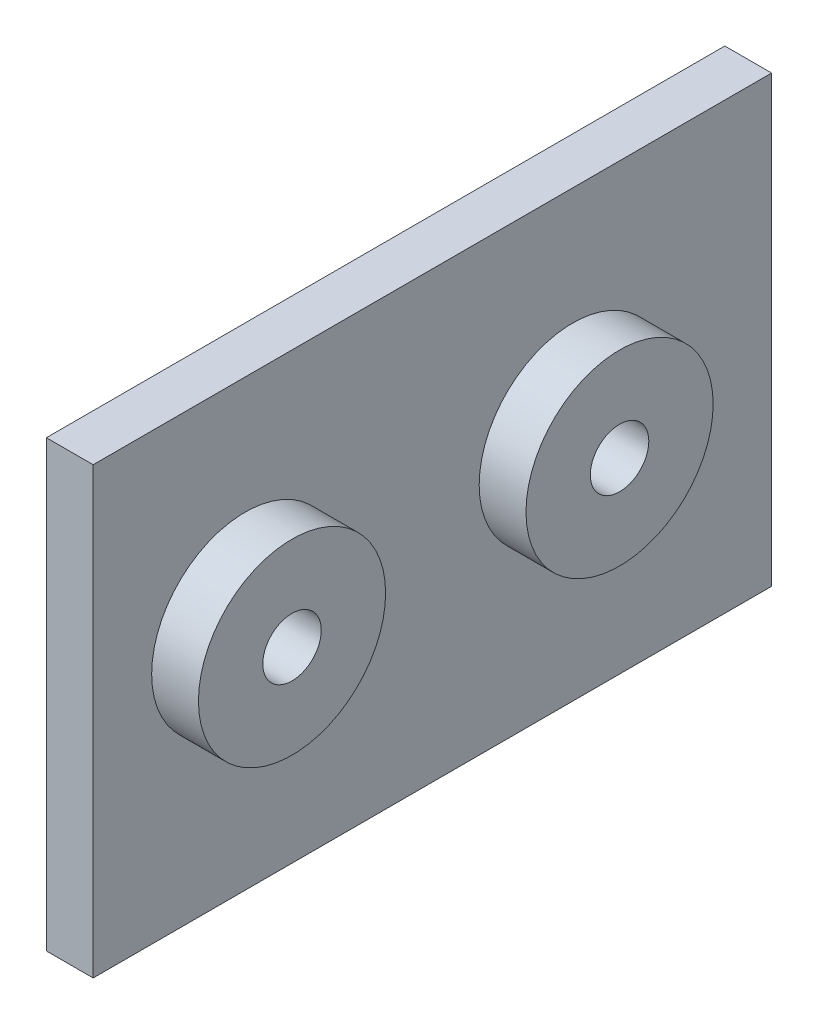
ISO-10303-21;
HEADER;
FILE_DESCRIPTION(('STEP AP214'),'2;1');
FILE_NAME('part.step','',(''),(''),'','','');
FILE_SCHEMA(('AUTOMOTIVE_DESIGN { 1 0 10303 214 1 1 1 1 }'));
ENDSEC;
DATA;
#1=APPLICATION_CONTEXT('core data for automotive mechanical design processes');
#2=APPLICATION_PROTOCOL_DEFINITION('international standard','automotive_design',2000,#1);
#3=PRODUCT_CONTEXT('',#1,'mechanical');
#4=PRODUCT('Part','Part','',(#3));
#5=PRODUCT_RELATED_PRODUCT_CATEGORY('part','',(#4));
#6=PRODUCT_DEFINITION_FORMATION('','',#4);
#7=PRODUCT_DEFINITION_CONTEXT('part definition',#1,'design');
#8=PRODUCT_DEFINITION('design','',#6,#7);
#9=PRODUCT_DEFINITION_SHAPE('','',#8);
#10=(LENGTH_UNIT() NAMED_UNIT(*) SI_UNIT(.MILLI.,.METRE.));
#11=(NAMED_UNIT(*) PLANE_ANGLE_UNIT() SI_UNIT($,.RADIAN.));
#12=(NAMED_UNIT(*) SI_UNIT($,.STERADIAN.) SOLID_ANGLE_UNIT());
#13=UNCERTAINTY_MEASURE_WITH_UNIT(LENGTH_MEASURE(1.E-05),#10,'distance_accuracy_value','');
#14=(GEOMETRIC_REPRESENTATION_CONTEXT(3) GLOBAL_UNCERTAINTY_ASSIGNED_CONTEXT((#13)) GLOBAL_UNIT_ASSIGNED_CONTEXT((#10,
#11,#12)) REPRESENTATION_CONTEXT('',''));
#15=CARTESIAN_POINT('',(0.,0.,0.));
#16=DIRECTION('',(0.,0.,1.));
#17=DIRECTION('',(1.,0.,0.));
#18=AXIS2_PLACEMENT_3D('',#15,#16,#17);
#19=CARTESIAN_POINT('',(2.,0.,0.));
#20=DIRECTION('',(1.,0.,0.));
#21=DIRECTION('',(0.,0.,-1.));
#22=AXIS2_PLACEMENT_3D('',#19,#20,#21);
#23=PLANE('',#22);
#24=CARTESIAN_POINT('',(2.,0.,5.92692307692308));
#25=DIRECTION('',(1.,0.,0.));
#26=DIRECTION('',(0.,0.,-1.));
#27=AXIS2_PLACEMENT_3D('',#24,#25,#26);
#28=CIRCLE('',#27,4.);
#29=CARTESIAN_POINT('',(2.,0.,1.92692307692308));
#30=VERTEX_POINT('',#29);
#31=EDGE_CURVE('E204',#30,#30,#28,.T.);
#32=ORIENTED_EDGE('',*,*,#31,.F.);
#33=EDGE_LOOP('',(#32));
#34=FACE_BOUND('',#33,.T.);
#35=CARTESIAN_POINT('',(2.,0.,-8.07307692307692));
#36=DIRECTION('',(1.,0.,0.));
#37=DIRECTION('',(0.,0.,-1.));
#38=AXIS2_PLACEMENT_3D('',#35,#36,#37);
#39=CIRCLE('',#38,4.);
#40=CARTESIAN_POINT('',(2.,0.,-12.0730769230769));
#41=VERTEX_POINT('',#40);
#42=EDGE_CURVE('E11',#41,#41,#39,.T.);
#43=ORIENTED_EDGE('',*,*,#42,.F.);
#44=EDGE_LOOP('',(#43));
#45=FACE_BOUND('',#44,.T.);
#46=DIRECTION('',(0.,-1.,0.));
#47=VECTOR('',#46,1.);
#48=CARTESIAN_POINT('',(2.,9.00192307692308,12.4269230769231));
#49=LINE('',#48,#47);
#50=CARTESIAN_POINT('',(2.,9.00192307692308,12.4269230769231));
#51=VERTEX_POINT('',#50);
#52=CARTESIAN_POINT('',(2.,-9.99807692307692,12.4269230769231));
#53=VERTEX_POINT('',#52);
#54=EDGE_CURVE('E152',#51,#53,#49,.T.);
#55=ORIENTED_EDGE('',*,*,#54,.T.);
#56=DIRECTION('',(0.,0.,-1.));
#57=VECTOR('',#56,1.);
#58=CARTESIAN_POINT('',(2.,-9.99807692307692,12.4269230769231));
#59=LINE('',#58,#57);
#60=CARTESIAN_POINT('',(2.,-9.99807692307692,-16.5730769230769));
#61=VERTEX_POINT('',#60);
#62=EDGE_CURVE('E155',#53,#61,#59,.T.);
#63=ORIENTED_EDGE('',*,*,#62,.T.);
#64=DIRECTION('',(0.,1.,0.));
#65=VECTOR('',#64,1.);
#66=CARTESIAN_POINT('',(2.,9.00192307692308,-16.5730769230769));
#67=LINE('',#66,#65);
#68=CARTESIAN_POINT('',(2.,9.00192307692308,-16.5730769230769));
#69=VERTEX_POINT('',#68);
#70=EDGE_CURVE('E158',#61,#69,#67,.T.);
#71=ORIENTED_EDGE('',*,*,#70,.T.);
#72=DIRECTION('',(0.,0.,1.));
#73=VECTOR('',#72,1.);
#74=CARTESIAN_POINT('',(2.,9.00192307692308,12.4269230769231));
#75=LINE('',#74,#73);
#76=EDGE_CURVE('E160',#69,#51,#75,.T.);
#77=ORIENTED_EDGE('',*,*,#76,.T.);
#78=EDGE_LOOP('',(#55,#63,#71,#77));
#79=FACE_BOUND('',#78,.T.);
#80=ADVANCED_FACE('F35',(#34,#45,#79),#23,.T.);
#81=CARTESIAN_POINT('',(0.,0.,0.));
#82=DIRECTION('',(1.,0.,0.));
#83=DIRECTION('',(0.,0.,-1.));
#84=AXIS2_PLACEMENT_3D('',#81,#82,#83);
#85=PLANE('',#84);
#86=DIRECTION('',(0.,-1.,0.));
#87=VECTOR('',#86,1.);
#88=CARTESIAN_POINT('',(0.,9.00192307692308,12.4269230769231));
#89=LINE('',#88,#87);
#90=CARTESIAN_POINT('',(0.,9.00192307692308,12.4269230769231));
#91=VERTEX_POINT('',#90);
#92=CARTESIAN_POINT('',(0.,-9.99807692307692,12.4269230769231));
#93=VERTEX_POINT('',#92);
#94=EDGE_CURVE('E141',#91,#93,#89,.T.);
#95=ORIENTED_EDGE('',*,*,#94,.F.);
#96=DIRECTION('',(0.,0.,1.));
#97=VECTOR('',#96,1.);
#98=CARTESIAN_POINT('',(0.,9.00192307692308,12.4269230769231));
#99=LINE('',#98,#97);
#100=CARTESIAN_POINT('',(0.,9.00192307692308,-16.5730769230769));
#101=VERTEX_POINT('',#100);
#102=EDGE_CURVE('E156',#101,#91,#99,.T.);
#103=ORIENTED_EDGE('',*,*,#102,.F.);
#104=DIRECTION('',(0.,1.,0.));
#105=VECTOR('',#104,1.);
#106=CARTESIAN_POINT('',(0.,9.00192307692308,-16.5730769230769));
#107=LINE('',#106,#105);
#108=CARTESIAN_POINT('',(0.,-9.99807692307692,-16.5730769230769));
#109=VERTEX_POINT('',#108);
#110=EDGE_CURVE('E164',#109,#101,#107,.T.);
#111=ORIENTED_EDGE('',*,*,#110,.F.);
#112=DIRECTION('',(0.,0.,-1.));
#113=VECTOR('',#112,1.);
#114=CARTESIAN_POINT('',(0.,-9.99807692307692,12.4269230769231));
#115=LINE('',#114,#113);
#116=EDGE_CURVE('E143',#93,#109,#115,.T.);
#117=ORIENTED_EDGE('',*,*,#116,.F.);
#118=EDGE_LOOP('',(#95,#103,#111,#117));
#119=FACE_BOUND('',#118,.T.);
#120=CARTESIAN_POINT('',(0.,0.00192307692307883,-8.07307692307692));
#121=DIRECTION('',(1.,0.,0.));
#122=DIRECTION('',(0.,0.,-1.));
#123=AXIS2_PLACEMENT_3D('',#120,#121,#122);
#124=CIRCLE('',#123,1.25);
#125=CARTESIAN_POINT('',(0.,0.00192307692307883,-9.32307692307692));
#126=VERTEX_POINT('',#125);
#127=EDGE_CURVE('E96',#126,#126,#124,.T.);
#128=ORIENTED_EDGE('',*,*,#127,.T.);
#129=EDGE_LOOP('',(#128));
#130=FACE_BOUND('',#129,.T.);
#131=CARTESIAN_POINT('',(0.,0.0019230769230772,5.92692307692308));
#132=DIRECTION('',(1.,0.,0.));
#133=DIRECTION('',(0.,0.,-1.));
#134=AXIS2_PLACEMENT_3D('',#131,#132,#133);
#135=CIRCLE('',#134,1.25);
#136=CARTESIAN_POINT('',(0.,0.0019230769230772,4.67692307692308));
#137=VERTEX_POINT('',#136);
#138=EDGE_CURVE('E97',#137,#137,#135,.T.);
#139=ORIENTED_EDGE('',*,*,#138,.T.);
#140=EDGE_LOOP('',(#139));
#141=FACE_BOUND('',#140,.T.);
#142=ADVANCED_FACE('F187',(#119,#130,#141),#85,.F.);
#143=CARTESIAN_POINT('',(2.,9.00192307692308,12.4269230769231));
#144=DIRECTION('',(0.,0.,-1.));
#145=DIRECTION('',(0.,1.,0.));
#146=AXIS2_PLACEMENT_3D('',#143,#144,#145);
#147=PLANE('',#146);
#148=ORIENTED_EDGE('',*,*,#94,.T.);
#149=DIRECTION('',(-1.,0.,0.));
#150=VECTOR('',#149,1.);
#151=CARTESIAN_POINT('',(2.,-9.99807692307692,12.4269230769231));
#152=LINE('',#151,#150);
#153=EDGE_CURVE('E175',#53,#93,#152,.T.);
#154=ORIENTED_EDGE('',*,*,#153,.F.);
#155=ORIENTED_EDGE('',*,*,#54,.F.);
#156=DIRECTION('',(-1.,0.,0.));
#157=VECTOR('',#156,1.);
#158=CARTESIAN_POINT('',(2.,9.00192307692308,12.4269230769231));
#159=LINE('',#158,#157);
#160=EDGE_CURVE('E161',#51,#91,#159,.T.);
#161=ORIENTED_EDGE('',*,*,#160,.T.);
#162=EDGE_LOOP('',(#148,#154,#155,#161));
#163=FACE_BOUND('',#162,.T.);
#164=ADVANCED_FACE('F37',(#163),#147,.F.);
#165=CARTESIAN_POINT('',(2.,-9.99807692307692,12.4269230769231));
#166=DIRECTION('',(0.,1.,0.));
#167=DIRECTION('',(0.,0.,1.));
#168=AXIS2_PLACEMENT_3D('',#165,#166,#167);
#169=PLANE('',#168);
#170=ORIENTED_EDGE('',*,*,#116,.T.);
#171=DIRECTION('',(-1.,0.,0.));
#172=VECTOR('',#171,1.);
#173=CARTESIAN_POINT('',(2.,-9.99807692307692,-16.5730769230769));
#174=LINE('',#173,#172);
#175=EDGE_CURVE('E172',#61,#109,#174,.T.);
#176=ORIENTED_EDGE('',*,*,#175,.F.);
#177=ORIENTED_EDGE('',*,*,#62,.F.);
#178=ORIENTED_EDGE('',*,*,#153,.T.);
#179=EDGE_LOOP('',(#170,#176,#177,#178));
#180=FACE_BOUND('',#179,.T.);
#181=ADVANCED_FACE('F179',(#180),#169,.F.);
#182=CARTESIAN_POINT('',(2.,9.00192307692308,-16.5730769230769));
#183=DIRECTION('',(0.,0.,1.));
#184=DIRECTION('',(1.,0.,0.));
#185=AXIS2_PLACEMENT_3D('',#182,#183,#184);
#186=PLANE('',#185);
#187=ORIENTED_EDGE('',*,*,#110,.T.);
#188=DIRECTION('',(-1.,0.,0.));
#189=VECTOR('',#188,1.);
#190=CARTESIAN_POINT('',(2.,9.00192307692308,-16.5730769230769));
#191=LINE('',#190,#189);
#192=EDGE_CURVE('E169',#69,#101,#191,.T.);
#193=ORIENTED_EDGE('',*,*,#192,.F.);
#194=ORIENTED_EDGE('',*,*,#70,.F.);
#195=ORIENTED_EDGE('',*,*,#175,.T.);
#196=EDGE_LOOP('',(#187,#193,#194,#195));
#197=FACE_BOUND('',#196,.T.);
#198=ADVANCED_FACE('F191',(#197),#186,.F.);
#199=CARTESIAN_POINT('',(2.,9.00192307692308,12.4269230769231));
#200=DIRECTION('',(0.,-1.,0.));
#201=DIRECTION('',(0.,0.,-1.));
#202=AXIS2_PLACEMENT_3D('',#199,#200,#201);
#203=PLANE('',#202);
#204=ORIENTED_EDGE('',*,*,#102,.T.);
#205=ORIENTED_EDGE('',*,*,#160,.F.);
#206=ORIENTED_EDGE('',*,*,#76,.F.);
#207=ORIENTED_EDGE('',*,*,#192,.T.);
#208=EDGE_LOOP('',(#204,#205,#206,#207));
#209=FACE_BOUND('',#208,.T.);
#210=ADVANCED_FACE('F124',(#209),#203,.F.);
#211=CARTESIAN_POINT('',(2.,0.00192307692307883,-8.07307692307692));
#212=DIRECTION('',(-1.,0.,0.));
#213=DIRECTION('',(0.,0.,1.));
#214=AXIS2_PLACEMENT_3D('',#211,#212,#213);
#215=CYLINDRICAL_SURFACE('',#214,1.25);
#216=CARTESIAN_POINT('',(2.,0.00192307692307883,-8.07307692307692));
#217=DIRECTION('',(1.,0.,0.));
#218=DIRECTION('',(0.,-0.000769230769231596,0.999999704141968));
#219=AXIS2_PLACEMENT_3D('',#216,#217,#218);
#220=CIRCLE('',#219,1.25);
#221=CARTESIAN_POINT('',(2.,0.000961538461539415,-6.82307729289946));
#222=VERTEX_POINT('',#221);
#223=CARTESIAN_POINT('',(2.,0.000961538461539414,-9.32307655325438));
#224=VERTEX_POINT('',#223);
#225=EDGE_CURVE('E46',#222,#224,#220,.T.);
#226=ORIENTED_EDGE('',*,*,#225,.T.);
#227=CARTESIAN_POINT('',(2.,0.00192307692307883,-8.07307692307692));
#228=DIRECTION('',(1.,0.,0.));
#229=DIRECTION('',(0.,-0.000769230769230985,-0.999999704141968));
#230=AXIS2_PLACEMENT_3D('',#227,#228,#229);
#231=CIRCLE('',#230,1.25);
#232=EDGE_CURVE('E61',#224,#222,#231,.T.);
#233=ORIENTED_EDGE('',*,*,#232,.T.);
#234=EDGE_LOOP('',(#226,#233));
#235=FACE_BOUND('',#234,.T.);
#236=ORIENTED_EDGE('',*,*,#127,.F.);
#237=EDGE_LOOP('',(#236));
#238=FACE_BOUND('',#237,.T.);
#239=ADVANCED_FACE('F117',(#235,#238),#215,.F.);
#240=CARTESIAN_POINT('',(2.,0.0019230769230772,5.92692307692308));
#241=DIRECTION('',(-1.,0.,0.));
#242=DIRECTION('',(0.,0.,1.));
#243=AXIS2_PLACEMENT_3D('',#240,#241,#242);
#244=CYLINDRICAL_SURFACE('',#243,1.25);
#245=CARTESIAN_POINT('',(2.,0.0019230769230772,5.92692307692308));
#246=DIRECTION('',(1.,0.,0.));
#247=DIRECTION('',(0.,-0.000769230769230708,0.999999704141968));
#248=AXIS2_PLACEMENT_3D('',#245,#246,#247);
#249=CIRCLE('',#248,1.25);
#250=CARTESIAN_POINT('',(2.,0.000961538461538602,7.17692270710054));
#251=VERTEX_POINT('',#250);
#252=CARTESIAN_POINT('',(2.,0.000961538461538601,4.67692344674562));
#253=VERTEX_POINT('',#252);
#254=EDGE_CURVE('E53',#251,#253,#249,.T.);
#255=ORIENTED_EDGE('',*,*,#254,.T.);
#256=CARTESIAN_POINT('',(2.,0.0019230769230772,5.92692307692308));
#257=DIRECTION('',(1.,0.,0.));
#258=DIRECTION('',(0.,-0.000769230769230984,-0.999999704141968));
#259=AXIS2_PLACEMENT_3D('',#256,#257,#258);
#260=CIRCLE('',#259,1.25);
#261=EDGE_CURVE('E91',#253,#251,#260,.T.);
#262=ORIENTED_EDGE('',*,*,#261,.T.);
#263=EDGE_LOOP('',(#255,#262));
#264=FACE_BOUND('',#263,.T.);
#265=ORIENTED_EDGE('',*,*,#138,.F.);
#266=EDGE_LOOP('',(#265));
#267=FACE_BOUND('',#266,.T.);
#268=ADVANCED_FACE('F100',(#264,#267),#244,.F.);
#269=CARTESIAN_POINT('',(4.,0.,-8.07307692307692));
#270=DIRECTION('',(1.,0.,0.));
#271=DIRECTION('',(0.,0.,-1.));
#272=AXIS2_PLACEMENT_3D('',#269,#270,#271);
#273=PLANE('',#272);
#274=CARTESIAN_POINT('',(4.,0.,-8.07307692307692));
#275=DIRECTION('',(1.,0.,0.));
#276=DIRECTION('',(0.,0.,-1.));
#277=AXIS2_PLACEMENT_3D('',#274,#275,#276);
#278=CIRCLE('',#277,4.);
#279=CARTESIAN_POINT('',(4.,0.,-12.0730769230769));
#280=VERTEX_POINT('',#279);
#281=EDGE_CURVE('E220',#280,#280,#278,.T.);
#282=ORIENTED_EDGE('',*,*,#281,.T.);
#283=EDGE_LOOP('',(#282));
#284=FACE_BOUND('',#283,.T.);
#285=CARTESIAN_POINT('',(4.,0.,-8.07307692307692));
#286=DIRECTION('',(1.,0.,0.));
#287=DIRECTION('',(0.,0.,-1.));
#288=AXIS2_PLACEMENT_3D('',#285,#286,#287);
#289=CIRCLE('',#288,1.25);
#290=CARTESIAN_POINT('',(4.,0.,-9.32307692307692));
#291=VERTEX_POINT('',#290);
#292=EDGE_CURVE('E221',#291,#291,#289,.T.);
#293=ORIENTED_EDGE('',*,*,#292,.F.);
#294=EDGE_LOOP('',(#293));
#295=FACE_BOUND('',#294,.T.);
#296=ADVANCED_FACE('F116',(#284,#295),#273,.T.);
#297=CARTESIAN_POINT('',(4.,0.,-8.07307692307692));
#298=DIRECTION('',(-1.,0.,0.));
#299=DIRECTION('',(0.,0.,1.));
#300=AXIS2_PLACEMENT_3D('',#297,#298,#299);
#301=CYLINDRICAL_SURFACE('',#300,4.);
#302=ORIENTED_EDGE('',*,*,#281,.F.);
#303=EDGE_LOOP('',(#302));
#304=FACE_BOUND('',#303,.T.);
#305=ORIENTED_EDGE('',*,*,#42,.T.);
#306=EDGE_LOOP('',(#305));
#307=FACE_BOUND('',#306,.T.);
#308=ADVANCED_FACE('F118',(#304,#307),#301,.T.);
#309=CARTESIAN_POINT('',(4.,0.,-8.07307692307692));
#310=DIRECTION('',(-1.,0.,0.));
#311=DIRECTION('',(0.,0.,1.));
#312=AXIS2_PLACEMENT_3D('',#309,#310,#311);
#313=CYLINDRICAL_SURFACE('',#312,1.25);
#314=ORIENTED_EDGE('',*,*,#292,.T.);
#315=EDGE_LOOP('',(#314));
#316=FACE_BOUND('',#315,.T.);
#317=ORIENTED_EDGE('',*,*,#232,.F.);
#318=ORIENTED_EDGE('',*,*,#225,.F.);
#319=EDGE_LOOP('',(#317,#318));
#320=FACE_BOUND('',#319,.T.);
#321=ADVANCED_FACE('F208',(#316,#320),#313,.F.);
#322=CARTESIAN_POINT('',(4.,0.,5.92692307692308));
#323=DIRECTION('',(1.,0.,0.));
#324=DIRECTION('',(0.,0.,-1.));
#325=AXIS2_PLACEMENT_3D('',#322,#323,#324);
#326=PLANE('',#325);
#327=CARTESIAN_POINT('',(4.,0.,5.92692307692308));
#328=DIRECTION('',(1.,0.,0.));
#329=DIRECTION('',(0.,0.,-1.));
#330=AXIS2_PLACEMENT_3D('',#327,#328,#329);
#331=CIRCLE('',#330,4.);
#332=CARTESIAN_POINT('',(4.,0.,1.92692307692308));
#333=VERTEX_POINT('',#332);
#334=EDGE_CURVE('E225',#333,#333,#331,.T.);
#335=ORIENTED_EDGE('',*,*,#334,.T.);
#336=EDGE_LOOP('',(#335));
#337=FACE_BOUND('',#336,.T.);
#338=CARTESIAN_POINT('',(4.,0.,5.92692307692308));
#339=DIRECTION('',(1.,0.,0.));
#340=DIRECTION('',(0.,0.,-1.));
#341=AXIS2_PLACEMENT_3D('',#338,#339,#340);
#342=CIRCLE('',#341,1.25);
#343=CARTESIAN_POINT('',(4.,0.,4.67692307692308));
#344=VERTEX_POINT('',#343);
#345=EDGE_CURVE('E102',#344,#344,#342,.T.);
#346=ORIENTED_EDGE('',*,*,#345,.F.);
#347=EDGE_LOOP('',(#346));
#348=FACE_BOUND('',#347,.T.);
#349=ADVANCED_FACE('F214',(#337,#348),#326,.T.);
#350=CARTESIAN_POINT('',(4.,0.,5.92692307692308));
#351=DIRECTION('',(-1.,0.,0.));
#352=DIRECTION('',(0.,0.,1.));
#353=AXIS2_PLACEMENT_3D('',#350,#351,#352);
#354=CYLINDRICAL_SURFACE('',#353,4.);
#355=ORIENTED_EDGE('',*,*,#334,.F.);
#356=EDGE_LOOP('',(#355));
#357=FACE_BOUND('',#356,.T.);
#358=ORIENTED_EDGE('',*,*,#31,.T.);
#359=EDGE_LOOP('',(#358));
#360=FACE_BOUND('',#359,.T.);
#361=ADVANCED_FACE('F239',(#357,#360),#354,.T.);
#362=CARTESIAN_POINT('',(4.,0.,5.92692307692308));
#363=DIRECTION('',(-1.,0.,0.));
#364=DIRECTION('',(0.,0.,1.));
#365=AXIS2_PLACEMENT_3D('',#362,#363,#364);
#366=CYLINDRICAL_SURFACE('',#365,1.25);
#367=ORIENTED_EDGE('',*,*,#345,.T.);
#368=EDGE_LOOP('',(#367));
#369=FACE_BOUND('',#368,.T.);
#370=ORIENTED_EDGE('',*,*,#261,.F.);
#371=ORIENTED_EDGE('',*,*,#254,.F.);
#372=EDGE_LOOP('',(#370,#371));
#373=FACE_BOUND('',#372,.T.);
#374=ADVANCED_FACE('F93',(#369,#373),#366,.F.);
#375=CLOSED_SHELL('',(#80,#142,#164,#181,#198,#210,#239,#268,#296,#308,#321,#349,#361,#374));
#376=MANIFOLD_SOLID_BREP('B2',#375);
#377=ADVANCED_BREP_SHAPE_REPRESENTATION('',(#18,#376),#14);
#378=SHAPE_DEFINITION_REPRESENTATION(#9,#377);
ENDSEC;
END-ISO-10303-21;
